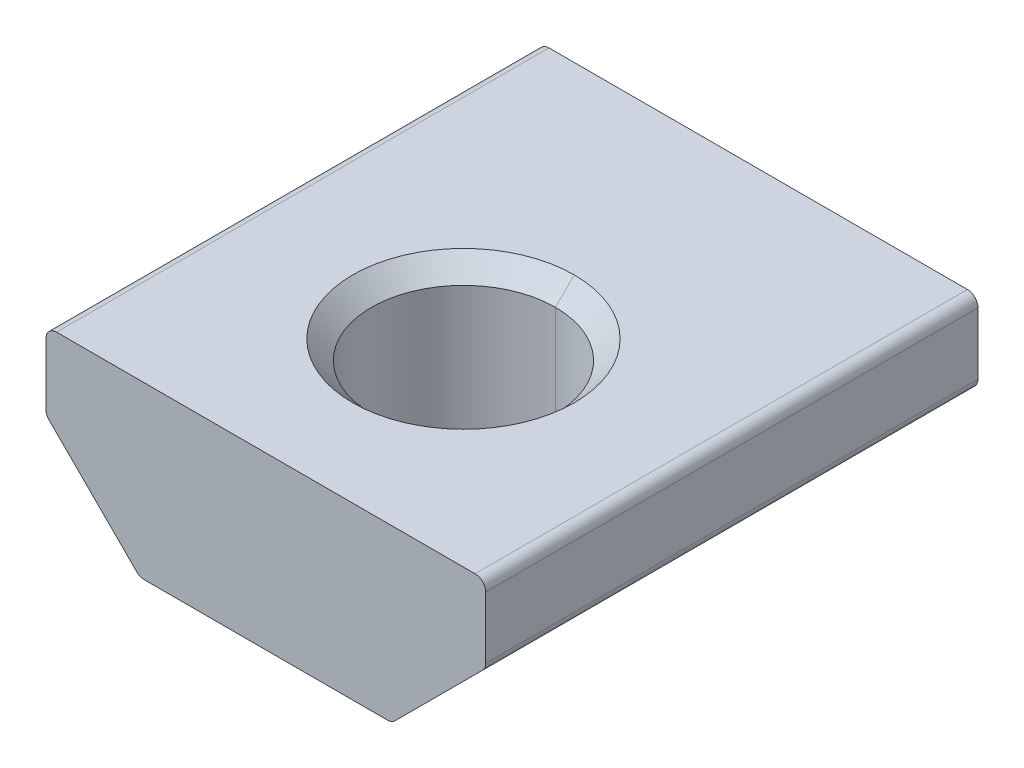
ISO-10303-21;
HEADER;
FILE_DESCRIPTION(('STEP AP214'),'2;1');
FILE_NAME('part.step','',(''),(''),'','','');
FILE_SCHEMA(('AUTOMOTIVE_DESIGN { 1 0 10303 214 1 1 1 1 }'));
ENDSEC;
DATA;
#1=APPLICATION_CONTEXT('core data for automotive mechanical design processes');
#2=APPLICATION_PROTOCOL_DEFINITION('international standard','automotive_design',2000,#1);
#3=PRODUCT_CONTEXT('',#1,'mechanical');
#4=PRODUCT('Part','Part','',(#3));
#5=PRODUCT_RELATED_PRODUCT_CATEGORY('part','',(#4));
#6=PRODUCT_DEFINITION_FORMATION('','',#4);
#7=PRODUCT_DEFINITION_CONTEXT('part definition',#1,'design');
#8=PRODUCT_DEFINITION('design','',#6,#7);
#9=PRODUCT_DEFINITION_SHAPE('','',#8);
#10=(LENGTH_UNIT() NAMED_UNIT(*) SI_UNIT(.MILLI.,.METRE.));
#11=(NAMED_UNIT(*) PLANE_ANGLE_UNIT() SI_UNIT($,.RADIAN.));
#12=(NAMED_UNIT(*) SI_UNIT($,.STERADIAN.) SOLID_ANGLE_UNIT());
#13=UNCERTAINTY_MEASURE_WITH_UNIT(LENGTH_MEASURE(1.E-05),#10,'distance_accuracy_value','');
#14=(GEOMETRIC_REPRESENTATION_CONTEXT(3) GLOBAL_UNCERTAINTY_ASSIGNED_CONTEXT((#13)) GLOBAL_UNIT_ASSIGNED_CONTEXT((#10,
#11,#12)) REPRESENTATION_CONTEXT('',''));
#15=CARTESIAN_POINT('',(0.,0.,0.));
#16=DIRECTION('',(0.,0.,1.));
#17=DIRECTION('',(1.,0.,0.));
#18=AXIS2_PLACEMENT_3D('',#15,#16,#17);
#19=CARTESIAN_POINT('',(-7.5565000000003,5.77850000000041,7.13739999999918));
#20=DIRECTION('',(0.,0.,-1.));
#21=DIRECTION('',(0.707106781186627,-0.707106781186463,0.));
#22=AXIS2_PLACEMENT_3D('',#19,#20,#21);
#23=CYLINDRICAL_SURFACE('',#22,0.380999999999916);
#24=CARTESIAN_POINT('',(-7.55650000000069,5.77849999999974,-10.6426000000013));
#25=DIRECTION('',(0.,0.,1.));
#26=DIRECTION('',(0.999999999999995,0.,0.));
#27=AXIS2_PLACEMENT_3D('',#24,#25,#26);
#28=CIRCLE('',#27,0.380999999999916);
#29=CARTESIAN_POINT('',(-7.55650000000047,6.15950000000054,-10.6426000000003));
#30=VERTEX_POINT('',#29);
#31=CARTESIAN_POINT('',(-7.9375000000001,5.77850000000069,-10.6426000000007));
#32=VERTEX_POINT('',#31);
#33=EDGE_CURVE('E13',#30,#32,#28,.T.);
#34=ORIENTED_EDGE('',*,*,#33,.T.);
#35=DIRECTION('',(0.,0.,-1.));
#36=VECTOR('',#35,1.);
#37=CARTESIAN_POINT('',(-7.93750000000071,5.77850000000096,7.13739999999902));
#38=LINE('',#37,#36);
#39=CARTESIAN_POINT('',(-7.93750000000071,5.77850000000096,7.13739999999902));
#40=VERTEX_POINT('',#39);
#41=EDGE_CURVE('E32',#40,#32,#38,.T.);
#42=ORIENTED_EDGE('',*,*,#41,.F.);
#43=CARTESIAN_POINT('',(-7.5565000000003,5.77850000000041,7.13739999999918));
#44=DIRECTION('',(0.,0.,1.));
#45=DIRECTION('',(0.999999999999995,0.,0.));
#46=AXIS2_PLACEMENT_3D('',#43,#44,#45);
#47=CIRCLE('',#46,0.380999999999916);
#48=CARTESIAN_POINT('',(-7.55650000000052,6.15950000000059,7.13739999999924));
#49=VERTEX_POINT('',#48);
#50=EDGE_CURVE('E365',#49,#40,#47,.T.);
#51=ORIENTED_EDGE('',*,*,#50,.F.);
#52=DIRECTION('',(0.,0.,-1.));
#53=VECTOR('',#52,1.);
#54=CARTESIAN_POINT('',(-7.55650000000052,6.15950000000059,7.13739999999924));
#55=LINE('',#54,#53);
#56=EDGE_CURVE('E361',#49,#30,#55,.T.);
#57=ORIENTED_EDGE('',*,*,#56,.T.);
#58=EDGE_LOOP('',(#34,#42,#51,#57));
#59=FACE_BOUND('',#58,.T.);
#60=ADVANCED_FACE('F24',(#59),#23,.T.);
#61=CARTESIAN_POINT('',(7.55650000000013,6.15950000000076,7.13739999999946));
#62=DIRECTION('',(0.,-0.999999999999995,0.));
#63=DIRECTION('',(0.,0.,-1.));
#64=AXIS2_PLACEMENT_3D('',#61,#62,#63);
#65=PLANE('',#64);
#66=CARTESIAN_POINT('',(0.,6.15950000000065,-8.32667268468867E-13));
#67=DIRECTION('',(0.,-0.999999999999995,0.));
#68=DIRECTION('',(0.,0.,-1.));
#69=AXIS2_PLACEMENT_3D('',#66,#67,#68);
#70=CIRCLE('',#69,4.);
#71=CARTESIAN_POINT('',(-2.22044604925031E-13,6.15950000000109,-4.00000000000039));
#72=VERTEX_POINT('',#71);
#73=CARTESIAN_POINT('',(-4.9960036108132E-13,6.15950000000132,3.99999999999945));
#74=VERTEX_POINT('',#73);
#75=EDGE_CURVE('E357',#72,#74,#70,.T.);
#76=ORIENTED_EDGE('',*,*,#75,.T.);
#77=CARTESIAN_POINT('',(0.,6.15950000000065,-8.32667268468867E-13));
#78=DIRECTION('',(0.,-0.999999999999995,0.));
#79=DIRECTION('',(0.,0.,-1.));
#80=AXIS2_PLACEMENT_3D('',#77,#78,#79);
#81=CIRCLE('',#80,4.);
#82=EDGE_CURVE('E163',#74,#72,#81,.T.);
#83=ORIENTED_EDGE('',*,*,#82,.T.);
#84=EDGE_LOOP('',(#76,#83));
#85=FACE_BOUND('',#84,.T.);
#86=DIRECTION('',(-0.999999999999995,0.,0.));
#87=VECTOR('',#86,1.);
#88=CARTESIAN_POINT('',(7.5565000000003,6.15949999999993,-10.6426000000004));
#89=LINE('',#88,#87);
#90=CARTESIAN_POINT('',(7.5565000000003,6.15949999999993,-10.6426000000004));
#91=VERTEX_POINT('',#90);
#92=EDGE_CURVE('E349',#91,#30,#89,.T.);
#93=ORIENTED_EDGE('',*,*,#92,.T.);
#94=ORIENTED_EDGE('',*,*,#56,.F.);
#95=DIRECTION('',(-0.999999999999995,0.,0.));
#96=VECTOR('',#95,1.);
#97=CARTESIAN_POINT('',(7.55650000000013,6.15950000000076,7.13739999999946));
#98=LINE('',#97,#96);
#99=CARTESIAN_POINT('',(7.55650000000013,6.15950000000076,7.13739999999946));
#100=VERTEX_POINT('',#99);
#101=EDGE_CURVE('E344',#100,#49,#98,.T.);
#102=ORIENTED_EDGE('',*,*,#101,.F.);
#103=DIRECTION('',(0.,0.,-1.));
#104=VECTOR('',#103,1.);
#105=CARTESIAN_POINT('',(7.55650000000013,6.15950000000076,7.13739999999946));
#106=LINE('',#105,#104);
#107=EDGE_CURVE('E340',#100,#91,#106,.T.);
#108=ORIENTED_EDGE('',*,*,#107,.T.);
#109=EDGE_LOOP('',(#93,#94,#102,#108));
#110=FACE_BOUND('',#109,.T.);
#111=ADVANCED_FACE('F382',(#85,#110),#65,.F.);
#112=CARTESIAN_POINT('',(7.55649999999985,5.77850000000085,7.13739999999979));
#113=DIRECTION('',(0.,0.,-1.));
#114=DIRECTION('',(-0.707106781186542,-0.707106781186545,0.));
#115=AXIS2_PLACEMENT_3D('',#112,#113,#114);
#116=CYLINDRICAL_SURFACE('',#115,0.380999999999915);
#117=CARTESIAN_POINT('',(7.5564999999998,5.77850000000041,-10.6426000000009));
#118=DIRECTION('',(0.,0.,1.));
#119=DIRECTION('',(0.999999999999995,0.,0.));
#120=AXIS2_PLACEMENT_3D('',#117,#118,#119);
#121=CIRCLE('',#120,0.380999999999915);
#122=CARTESIAN_POINT('',(7.93749999999938,5.7785000000003,-10.6426000000008));
#123=VERTEX_POINT('',#122);
#124=EDGE_CURVE('E335',#123,#91,#121,.T.);
#125=ORIENTED_EDGE('',*,*,#124,.T.);
#126=ORIENTED_EDGE('',*,*,#107,.F.);
#127=CARTESIAN_POINT('',(7.55649999999985,5.77850000000085,7.13739999999979));
#128=DIRECTION('',(0.,0.,1.));
#129=DIRECTION('',(0.999999999999995,0.,0.));
#130=AXIS2_PLACEMENT_3D('',#127,#128,#129);
#131=CIRCLE('',#130,0.380999999999915);
#132=CARTESIAN_POINT('',(7.93749999999993,5.77850000000046,7.13739999999918));
#133=VERTEX_POINT('',#132);
#134=EDGE_CURVE('E330',#133,#100,#131,.T.);
#135=ORIENTED_EDGE('',*,*,#134,.F.);
#136=DIRECTION('',(0.,0.,-1.));
#137=VECTOR('',#136,1.);
#138=CARTESIAN_POINT('',(7.93749999999993,5.77850000000046,7.13739999999918));
#139=LINE('',#138,#137);
#140=EDGE_CURVE('E326',#133,#123,#139,.T.);
#141=ORIENTED_EDGE('',*,*,#140,.T.);
#142=EDGE_LOOP('',(#125,#126,#135,#141));
#143=FACE_BOUND('',#142,.T.);
#144=ADVANCED_FACE('F420',(#143),#116,.T.);
#145=CARTESIAN_POINT('',(7.93749999999999,3.54554036726429,7.13739999999946));
#146=DIRECTION('',(-0.999999999999995,0.,0.));
#147=DIRECTION('',(0.,0.,1.));
#148=AXIS2_PLACEMENT_3D('',#145,#146,#147);
#149=PLANE('',#148);
#150=DIRECTION('',(0.,0.999999999999995,0.));
#151=VECTOR('',#150,1.);
#152=CARTESIAN_POINT('',(7.93749999999993,3.54554036726423,-10.6426000000006));
#153=LINE('',#152,#151);
#154=CARTESIAN_POINT('',(7.93749999999993,3.54554036726423,-10.6426000000006));
#155=VERTEX_POINT('',#154);
#156=EDGE_CURVE('E321',#155,#123,#153,.T.);
#157=ORIENTED_EDGE('',*,*,#156,.T.);
#158=ORIENTED_EDGE('',*,*,#140,.F.);
#159=DIRECTION('',(0.,0.999999999999995,0.));
#160=VECTOR('',#159,1.);
#161=CARTESIAN_POINT('',(7.93749999999999,3.54554036726429,7.13739999999946));
#162=LINE('',#161,#160);
#163=CARTESIAN_POINT('',(7.93749999999999,3.54554036726429,7.13739999999946));
#164=VERTEX_POINT('',#163);
#165=EDGE_CURVE('E316',#164,#133,#162,.T.);
#166=ORIENTED_EDGE('',*,*,#165,.F.);
#167=DIRECTION('',(0.,0.,-1.));
#168=VECTOR('',#167,1.);
#169=CARTESIAN_POINT('',(7.93749999999999,3.54554036726429,7.13739999999946));
#170=LINE('',#169,#168);
#171=EDGE_CURVE('E312',#164,#155,#170,.T.);
#172=ORIENTED_EDGE('',*,*,#171,.T.);
#173=EDGE_LOOP('',(#157,#158,#166,#172));
#174=FACE_BOUND('',#173,.T.);
#175=ADVANCED_FACE('F418',(#174),#149,.F.);
#176=CARTESIAN_POINT('',(7.55650000000013,3.54554036726434,7.13739999999957));
#177=DIRECTION('',(0.,0.,-1.));
#178=DIRECTION('',(-0.923879532511274,0.382683432365106,0.));
#179=AXIS2_PLACEMENT_3D('',#176,#177,#178);
#180=CYLINDRICAL_SURFACE('',#179,0.380999999999765);
#181=CARTESIAN_POINT('',(7.5564999999998,3.54554036726462,-10.642600000001));
#182=DIRECTION('',(0.,0.,1.));
#183=DIRECTION('',(0.999999999999995,0.,0.));
#184=AXIS2_PLACEMENT_3D('',#181,#182,#183);
#185=CIRCLE('',#184,0.380999999999765);
#186=CARTESIAN_POINT('',(7.82590768363201,3.27613268363269,-10.6426000000009));
#187=VERTEX_POINT('',#186);
#188=EDGE_CURVE('E307',#187,#155,#185,.T.);
#189=ORIENTED_EDGE('',*,*,#188,.T.);
#190=ORIENTED_EDGE('',*,*,#171,.F.);
#191=CARTESIAN_POINT('',(7.55650000000013,3.54554036726434,7.13739999999957));
#192=DIRECTION('',(0.,0.,1.));
#193=DIRECTION('',(0.999999999999995,0.,0.));
#194=AXIS2_PLACEMENT_3D('',#191,#192,#193);
#195=CIRCLE('',#194,0.380999999999765);
#196=CARTESIAN_POINT('',(7.82590768363156,3.27613268363269,7.13739999999896));
#197=VERTEX_POINT('',#196);
#198=EDGE_CURVE('E302',#197,#164,#195,.T.);
#199=ORIENTED_EDGE('',*,*,#198,.F.);
#200=DIRECTION('',(0.,0.,-1.));
#201=VECTOR('',#200,1.);
#202=CARTESIAN_POINT('',(7.82590768363156,3.27613268363269,7.13739999999896));
#203=LINE('',#202,#201);
#204=EDGE_CURVE('E298',#197,#187,#203,.T.);
#205=ORIENTED_EDGE('',*,*,#204,.T.);
#206=EDGE_LOOP('',(#189,#190,#199,#205));
#207=FACE_BOUND('',#206,.T.);
#208=ADVANCED_FACE('F413',(#207),#180,.T.);
#209=CARTESIAN_POINT('',(4.66136731636735,0.111592316368148,7.13740000000007));
#210=DIRECTION('',(-0.707106781186542,0.707106781186548,0.));
#211=DIRECTION('',(-0.707106781186546,-0.707106781186541,0.));
#212=AXIS2_PLACEMENT_3D('',#209,#210,#211);
#213=PLANE('',#212);
#214=DIRECTION('',(0.707106781186546,0.707106781186541,0.));
#215=VECTOR('',#214,1.);
#216=CARTESIAN_POINT('',(4.66136731636829,0.111592316368203,-10.6426000000008));
#217=LINE('',#216,#215);
#218=CARTESIAN_POINT('',(4.66136731636829,0.111592316368203,-10.6426000000008));
#219=VERTEX_POINT('',#218);
#220=EDGE_CURVE('E293',#219,#187,#217,.T.);
#221=ORIENTED_EDGE('',*,*,#220,.T.);
#222=ORIENTED_EDGE('',*,*,#204,.F.);
#223=DIRECTION('',(0.707106781186546,0.707106781186541,0.));
#224=VECTOR('',#223,1.);
#225=CARTESIAN_POINT('',(4.66136731636735,0.111592316368148,7.13740000000007));
#226=LINE('',#225,#224);
#227=CARTESIAN_POINT('',(4.66136731636735,0.111592316368148,7.13740000000007));
#228=VERTEX_POINT('',#227);
#229=EDGE_CURVE('E288',#228,#197,#226,.T.);
#230=ORIENTED_EDGE('',*,*,#229,.F.);
#231=DIRECTION('',(0.,0.,-1.));
#232=VECTOR('',#231,1.);
#233=CARTESIAN_POINT('',(4.66136731636735,0.111592316368148,7.13740000000007));
#234=LINE('',#233,#232);
#235=EDGE_CURVE('E284',#228,#219,#234,.T.);
#236=ORIENTED_EDGE('',*,*,#235,.T.);
#237=EDGE_LOOP('',(#221,#222,#230,#236));
#238=FACE_BOUND('',#237,.T.);
#239=ADVANCED_FACE('F410',(#238),#213,.F.);
#240=CARTESIAN_POINT('',(4.39195963273559,0.381000000000575,7.13739999999957));
#241=DIRECTION('',(0.,0.,-1.));
#242=DIRECTION('',(-0.382683432365044,0.923879532511302,0.));
#243=AXIS2_PLACEMENT_3D('',#240,#241,#242);
#244=CYLINDRICAL_SURFACE('',#243,0.381000000000144);
#245=CARTESIAN_POINT('',(4.39195963273598,0.381000000000742,-10.6426000000002));
#246=DIRECTION('',(0.,0.,1.));
#247=DIRECTION('',(0.999999999999995,0.,0.));
#248=AXIS2_PLACEMENT_3D('',#245,#246,#247);
#249=CIRCLE('',#248,0.381000000000144);
#250=CARTESIAN_POINT('',(4.39195963273575,2.22044604925031E-13,-10.6426));
#251=VERTEX_POINT('',#250);
#252=EDGE_CURVE('E279',#251,#219,#249,.T.);
#253=ORIENTED_EDGE('',*,*,#252,.T.);
#254=ORIENTED_EDGE('',*,*,#235,.F.);
#255=CARTESIAN_POINT('',(4.39195963273559,0.381000000000575,7.13739999999957));
#256=DIRECTION('',(0.,0.,1.));
#257=DIRECTION('',(0.999999999999995,0.,0.));
#258=AXIS2_PLACEMENT_3D('',#255,#256,#257);
#259=CIRCLE('',#258,0.381000000000144);
#260=CARTESIAN_POINT('',(4.39195963273598,5.55111512312578E-13,7.13739999999957));
#261=VERTEX_POINT('',#260);
#262=EDGE_CURVE('E274',#261,#228,#259,.T.);
#263=ORIENTED_EDGE('',*,*,#262,.F.);
#264=DIRECTION('',(0.,0.,-1.));
#265=VECTOR('',#264,1.);
#266=CARTESIAN_POINT('',(4.39195963273598,5.55111512312578E-13,7.13739999999957));
#267=LINE('',#266,#265);
#268=EDGE_CURVE('E270',#261,#251,#267,.T.);
#269=ORIENTED_EDGE('',*,*,#268,.T.);
#270=EDGE_LOOP('',(#253,#254,#263,#269));
#271=FACE_BOUND('',#270,.T.);
#272=ADVANCED_FACE('F407',(#271),#244,.T.);
#273=CARTESIAN_POINT('',(-4.39195963273631,1.11022302462516E-13,7.13739999999929));
#274=DIRECTION('',(0.,0.999999999999995,0.));
#275=DIRECTION('',(0.,0.,1.));
#276=AXIS2_PLACEMENT_3D('',#273,#274,#275);
#277=PLANE('',#276);
#278=CARTESIAN_POINT('',(0.,0.,0.));
#279=DIRECTION('',(0.,-0.999999999999995,0.));
#280=DIRECTION('',(0.,0.,-1.));
#281=AXIS2_PLACEMENT_3D('',#278,#279,#280);
#282=CIRCLE('',#281,4.);
#283=CARTESIAN_POINT('',(0.,0.,3.99999999999934));
#284=VERTEX_POINT('',#283);
#285=CARTESIAN_POINT('',(3.33066907387547E-13,1.66533453693773E-13,-4.00000000000106));
#286=VERTEX_POINT('',#285);
#287=EDGE_CURVE('E265',#284,#286,#282,.T.);
#288=ORIENTED_EDGE('',*,*,#287,.F.);
#289=CARTESIAN_POINT('',(0.,0.,0.));
#290=DIRECTION('',(0.,-0.999999999999995,0.));
#291=DIRECTION('',(0.,0.,-1.));
#292=AXIS2_PLACEMENT_3D('',#289,#290,#291);
#293=CIRCLE('',#292,4.);
#294=EDGE_CURVE('E260',#286,#284,#293,.T.);
#295=ORIENTED_EDGE('',*,*,#294,.F.);
#296=EDGE_LOOP('',(#288,#295));
#297=FACE_BOUND('',#296,.T.);
#298=DIRECTION('',(0.999999999999995,0.,0.));
#299=VECTOR('',#298,1.);
#300=CARTESIAN_POINT('',(-4.39195963273586,8.88178419700125E-13,-10.6425999999999));
#301=LINE('',#300,#299);
#302=CARTESIAN_POINT('',(-4.39195963273586,8.88178419700125E-13,-10.6425999999999));
#303=VERTEX_POINT('',#302);
#304=EDGE_CURVE('E255',#303,#251,#301,.T.);
#305=ORIENTED_EDGE('',*,*,#304,.T.);
#306=ORIENTED_EDGE('',*,*,#268,.F.);
#307=DIRECTION('',(0.999999999999995,0.,0.));
#308=VECTOR('',#307,1.);
#309=CARTESIAN_POINT('',(-4.39195963273631,1.11022302462516E-13,7.13739999999929));
#310=LINE('',#309,#308);
#311=CARTESIAN_POINT('',(-4.39195963273631,1.11022302462516E-13,7.13739999999929));
#312=VERTEX_POINT('',#311);
#313=EDGE_CURVE('E250',#312,#261,#310,.T.);
#314=ORIENTED_EDGE('',*,*,#313,.F.);
#315=DIRECTION('',(0.,0.,-1.));
#316=VECTOR('',#315,1.);
#317=CARTESIAN_POINT('',(-4.39195963273631,1.11022302462516E-13,7.13739999999929));
#318=LINE('',#317,#316);
#319=EDGE_CURVE('E246',#312,#303,#318,.T.);
#320=ORIENTED_EDGE('',*,*,#319,.T.);
#321=EDGE_LOOP('',(#305,#306,#314,#320));
#322=FACE_BOUND('',#321,.T.);
#323=ADVANCED_FACE('F401',(#297,#322),#277,.F.);
#324=CARTESIAN_POINT('',(-4.39195963273592,0.38100000000002,7.13740000000007));
#325=DIRECTION('',(0.,0.,-1.));
#326=DIRECTION('',(0.382683432365162,0.923879532511251,0.));
#327=AXIS2_PLACEMENT_3D('',#324,#325,#326);
#328=CYLINDRICAL_SURFACE('',#327,0.380999999999677);
#329=CARTESIAN_POINT('',(-4.39195963273625,0.381000000000298,-10.6426000000001));
#330=DIRECTION('',(0.,0.,1.));
#331=DIRECTION('',(0.999999999999995,0.,0.));
#332=AXIS2_PLACEMENT_3D('',#329,#330,#331);
#333=CIRCLE('',#332,0.380999999999677);
#334=CARTESIAN_POINT('',(-4.66136731636807,0.111592316368425,-10.6426000000005));
#335=VERTEX_POINT('',#334);
#336=EDGE_CURVE('E241',#335,#303,#333,.T.);
#337=ORIENTED_EDGE('',*,*,#336,.T.);
#338=ORIENTED_EDGE('',*,*,#319,.F.);
#339=CARTESIAN_POINT('',(-4.39195963273592,0.38100000000002,7.13740000000007));
#340=DIRECTION('',(0.,0.,1.));
#341=DIRECTION('',(0.999999999999995,0.,0.));
#342=AXIS2_PLACEMENT_3D('',#339,#340,#341);
#343=CIRCLE('',#342,0.380999999999677);
#344=CARTESIAN_POINT('',(-4.66136731636874,0.111592316368314,7.13739999999935));
#345=VERTEX_POINT('',#344);
#346=EDGE_CURVE('E236',#345,#312,#343,.T.);
#347=ORIENTED_EDGE('',*,*,#346,.F.);
#348=DIRECTION('',(0.,0.,-1.));
#349=VECTOR('',#348,1.);
#350=CARTESIAN_POINT('',(-4.66136731636874,0.111592316368314,7.13739999999935));
#351=LINE('',#350,#349);
#352=EDGE_CURVE('E232',#345,#335,#351,.T.);
#353=ORIENTED_EDGE('',*,*,#352,.T.);
#354=EDGE_LOOP('',(#337,#338,#347,#353));
#355=FACE_BOUND('',#354,.T.);
#356=ADVANCED_FACE('F398',(#355),#328,.T.);
#357=CARTESIAN_POINT('',(-7.82590768363284,3.27613268363247,7.13739999999918));
#358=DIRECTION('',(0.70710678118654,0.707106781186547,0.));
#359=DIRECTION('',(-0.707106781186546,0.707106781186542,0.));
#360=AXIS2_PLACEMENT_3D('',#357,#358,#359);
#361=PLANE('',#360);
#362=DIRECTION('',(0.707106781186546,-0.707106781186542,0.));
#363=VECTOR('',#362,1.);
#364=CARTESIAN_POINT('',(-7.82590768363256,3.27613268363264,-10.6426000000008));
#365=LINE('',#364,#363);
#366=CARTESIAN_POINT('',(-7.82590768363256,3.27613268363264,-10.6426000000008));
#367=VERTEX_POINT('',#366);
#368=EDGE_CURVE('E227',#367,#335,#365,.T.);
#369=ORIENTED_EDGE('',*,*,#368,.T.);
#370=ORIENTED_EDGE('',*,*,#352,.F.);
#371=DIRECTION('',(0.707106781186546,-0.707106781186542,0.));
#372=VECTOR('',#371,1.);
#373=CARTESIAN_POINT('',(-7.82590768363284,3.27613268363247,7.13739999999918));
#374=LINE('',#373,#372);
#375=CARTESIAN_POINT('',(-7.82590768363284,3.27613268363247,7.13739999999918));
#376=VERTEX_POINT('',#375);
#377=EDGE_CURVE('E222',#376,#345,#374,.T.);
#378=ORIENTED_EDGE('',*,*,#377,.F.);
#379=DIRECTION('',(0.,0.,-1.));
#380=VECTOR('',#379,1.);
#381=CARTESIAN_POINT('',(-7.82590768363284,3.27613268363247,7.13739999999918));
#382=LINE('',#381,#380);
#383=EDGE_CURVE('E218',#376,#367,#382,.T.);
#384=ORIENTED_EDGE('',*,*,#383,.T.);
#385=EDGE_LOOP('',(#369,#370,#378,#384));
#386=FACE_BOUND('',#385,.T.);
#387=ADVANCED_FACE('F396',(#386),#361,.F.);
#388=CARTESIAN_POINT('',(-7.5565000000003,3.54554036726529,7.13739999999985));
#389=DIRECTION('',(0.,0.,-1.));
#390=DIRECTION('',(0.923879532511275,0.382683432365105,0.));
#391=AXIS2_PLACEMENT_3D('',#388,#389,#390);
#392=CYLINDRICAL_SURFACE('',#391,0.38100000000023);
#393=CARTESIAN_POINT('',(-7.55650000000008,3.54554036726473,-10.6426000000007));
#394=DIRECTION('',(0.,0.,1.));
#395=DIRECTION('',(0.999999999999995,0.,0.));
#396=AXIS2_PLACEMENT_3D('',#393,#394,#395);
#397=CIRCLE('',#396,0.38100000000023);
#398=CARTESIAN_POINT('',(-7.93750000000071,3.54554036726445,-10.6426000000003));
#399=VERTEX_POINT('',#398);
#400=EDGE_CURVE('E213',#399,#367,#397,.T.);
#401=ORIENTED_EDGE('',*,*,#400,.T.);
#402=ORIENTED_EDGE('',*,*,#383,.F.);
#403=CARTESIAN_POINT('',(-7.5565000000003,3.54554036726529,7.13739999999985));
#404=DIRECTION('',(0.,0.,1.));
#405=DIRECTION('',(0.999999999999995,0.,0.));
#406=AXIS2_PLACEMENT_3D('',#403,#404,#405);
#407=CIRCLE('',#406,0.38100000000023);
#408=CARTESIAN_POINT('',(-7.93750000000087,3.54554036726512,7.13739999999974));
#409=VERTEX_POINT('',#408);
#410=EDGE_CURVE('E208',#409,#376,#407,.T.);
#411=ORIENTED_EDGE('',*,*,#410,.F.);
#412=DIRECTION('',(0.,0.,-1.));
#413=VECTOR('',#412,1.);
#414=CARTESIAN_POINT('',(-7.93750000000087,3.54554036726512,7.13739999999974));
#415=LINE('',#414,#413);
#416=EDGE_CURVE('E204',#409,#399,#415,.T.);
#417=ORIENTED_EDGE('',*,*,#416,.T.);
#418=EDGE_LOOP('',(#401,#402,#411,#417));
#419=FACE_BOUND('',#418,.T.);
#420=ADVANCED_FACE('F392',(#419),#392,.T.);
#421=CARTESIAN_POINT('',(-7.93750000000071,5.77850000000096,7.13739999999902));
#422=DIRECTION('',(0.999999999999995,0.,0.));
#423=DIRECTION('',(0.,0.,-1.));
#424=AXIS2_PLACEMENT_3D('',#421,#422,#423);
#425=PLANE('',#424);
#426=DIRECTION('',(0.,-0.999999999999995,0.));
#427=VECTOR('',#426,1.);
#428=CARTESIAN_POINT('',(-7.9375000000001,5.77850000000069,-10.6426000000007));
#429=LINE('',#428,#427);
#430=EDGE_CURVE('E199',#32,#399,#429,.T.);
#431=ORIENTED_EDGE('',*,*,#430,.T.);
#432=ORIENTED_EDGE('',*,*,#416,.F.);
#433=DIRECTION('',(0.,-0.999999999999995,0.));
#434=VECTOR('',#433,1.);
#435=CARTESIAN_POINT('',(-7.93750000000071,5.77850000000096,7.13739999999902));
#436=LINE('',#435,#434);
#437=EDGE_CURVE('E194',#40,#409,#436,.T.);
#438=ORIENTED_EDGE('',*,*,#437,.F.);
#439=ORIENTED_EDGE('',*,*,#41,.T.);
#440=EDGE_LOOP('',(#431,#432,#438,#439));
#441=FACE_BOUND('',#440,.T.);
#442=ADVANCED_FACE('F375',(#441),#425,.F.);
#443=CARTESIAN_POINT('',(-7.5565000000003,5.77850000000041,7.13739999999918));
#444=DIRECTION('',(0.,0.,1.));
#445=DIRECTION('',(0.999999999999995,0.,0.));
#446=AXIS2_PLACEMENT_3D('',#443,#444,#445);
#447=PLANE('',#446);
#448=ORIENTED_EDGE('',*,*,#50,.T.);
#449=ORIENTED_EDGE('',*,*,#437,.T.);
#450=ORIENTED_EDGE('',*,*,#410,.T.);
#451=ORIENTED_EDGE('',*,*,#377,.T.);
#452=ORIENTED_EDGE('',*,*,#346,.T.);
#453=ORIENTED_EDGE('',*,*,#313,.T.);
#454=ORIENTED_EDGE('',*,*,#262,.T.);
#455=ORIENTED_EDGE('',*,*,#229,.T.);
#456=ORIENTED_EDGE('',*,*,#198,.T.);
#457=ORIENTED_EDGE('',*,*,#165,.T.);
#458=ORIENTED_EDGE('',*,*,#134,.T.);
#459=ORIENTED_EDGE('',*,*,#101,.T.);
#460=EDGE_LOOP('',(#448,#449,#450,#451,#452,#453,#454,#455,#456,#457,#458,#459));
#461=FACE_BOUND('',#460,.T.);
#462=ADVANCED_FACE('F379',(#461),#447,.T.);
#463=CARTESIAN_POINT('',(-7.55650000000069,5.77849999999974,-10.6426000000013));
#464=DIRECTION('',(0.,0.,1.));
#465=DIRECTION('',(0.999999999999995,0.,0.));
#466=AXIS2_PLACEMENT_3D('',#463,#464,#465);
#467=PLANE('',#466);
#468=ORIENTED_EDGE('',*,*,#33,.F.);
#469=ORIENTED_EDGE('',*,*,#92,.F.);
#470=ORIENTED_EDGE('',*,*,#124,.F.);
#471=ORIENTED_EDGE('',*,*,#156,.F.);
#472=ORIENTED_EDGE('',*,*,#188,.F.);
#473=ORIENTED_EDGE('',*,*,#220,.F.);
#474=ORIENTED_EDGE('',*,*,#252,.F.);
#475=ORIENTED_EDGE('',*,*,#304,.F.);
#476=ORIENTED_EDGE('',*,*,#336,.F.);
#477=ORIENTED_EDGE('',*,*,#368,.F.);
#478=ORIENTED_EDGE('',*,*,#400,.F.);
#479=ORIENTED_EDGE('',*,*,#430,.F.);
#480=EDGE_LOOP('',(#468,#469,#470,#471,#472,#473,#474,#475,#476,#477,#478,#479));
#481=FACE_BOUND('',#480,.T.);
#482=ADVANCED_FACE('F387',(#481),#467,.F.);
#483=CARTESIAN_POINT('',(2.22044604925031E-13,0.676500000001579,-9.99200722162641E-13));
#484=DIRECTION('',(0.,-0.999999999999995,0.));
#485=DIRECTION('',(-0.999999999999995,0.,0.));
#486=AXIS2_PLACEMENT_3D('',#483,#484,#485);
#487=CONICAL_SURFACE('',#486,3.3235,0.785398163397448);
#488=DIRECTION('',(0.,-0.707106781186545,0.707106781186549));
#489=VECTOR('',#488,1.);
#490=CARTESIAN_POINT('',(5.55111512312578E-13,0.676500000000912,3.32349999999959));
#491=LINE('',#490,#489);
#492=CARTESIAN_POINT('',(5.55111512312578E-13,0.676500000000912,3.32349999999959));
#493=VERTEX_POINT('',#492);
#494=EDGE_CURVE('E189',#493,#284,#491,.T.);
#495=ORIENTED_EDGE('',*,*,#494,.F.);
#496=CARTESIAN_POINT('',(2.22044604925031E-13,0.676500000001579,-9.99200722162641E-13));
#497=DIRECTION('',(0.,-0.999999999999995,0.));
#498=DIRECTION('',(0.,0.,-1.));
#499=AXIS2_PLACEMENT_3D('',#496,#497,#498);
#500=CIRCLE('',#499,3.3235);
#501=CARTESIAN_POINT('',(-2.22044604925031E-13,0.676500000001246,-3.3235000000012));
#502=VERTEX_POINT('',#501);
#503=EDGE_CURVE('E152',#502,#493,#500,.T.);
#504=ORIENTED_EDGE('',*,*,#503,.F.);
#505=DIRECTION('',(0.,-0.707106781186546,-0.707106781186548));
#506=VECTOR('',#505,1.);
#507=CARTESIAN_POINT('',(-2.22044604925031E-13,0.676500000001246,-3.3235000000012));
#508=LINE('',#507,#506);
#509=EDGE_CURVE('E181',#502,#286,#508,.T.);
#510=ORIENTED_EDGE('',*,*,#509,.T.);
#511=ORIENTED_EDGE('',*,*,#294,.T.);
#512=EDGE_LOOP('',(#495,#504,#510,#511));
#513=FACE_BOUND('',#512,.T.);
#514=ADVANCED_FACE('F537',(#513),#487,.F.);
#515=CARTESIAN_POINT('',(2.22044604925031E-13,0.676500000001579,-9.99200722162641E-13));
#516=DIRECTION('',(0.,-0.999999999999995,0.));
#517=DIRECTION('',(0.999999999999994,0.,0.));
#518=AXIS2_PLACEMENT_3D('',#515,#516,#517);
#519=CONICAL_SURFACE('',#518,3.3235,0.785398163397448);
#520=ORIENTED_EDGE('',*,*,#494,.T.);
#521=ORIENTED_EDGE('',*,*,#287,.T.);
#522=ORIENTED_EDGE('',*,*,#509,.F.);
#523=CARTESIAN_POINT('',(2.22044604925031E-13,0.676500000001579,-9.99200722162641E-13));
#524=DIRECTION('',(0.,-0.999999999999995,0.));
#525=DIRECTION('',(0.,0.,-1.));
#526=AXIS2_PLACEMENT_3D('',#523,#524,#525);
#527=CIRCLE('',#526,3.3235);
#528=EDGE_CURVE('E153',#493,#502,#527,.T.);
#529=ORIENTED_EDGE('',*,*,#528,.F.);
#530=EDGE_LOOP('',(#520,#521,#522,#529));
#531=FACE_BOUND('',#530,.T.);
#532=ADVANCED_FACE('F546',(#531),#519,.F.);
#533=CARTESIAN_POINT('',(0.,0.,0.));
#534=DIRECTION('',(0.,-0.999999999999995,0.));
#535=DIRECTION('',(0.999999999999994,0.,0.));
#536=AXIS2_PLACEMENT_3D('',#533,#534,#535);
#537=CYLINDRICAL_SURFACE('',#536,3.3235);
#538=DIRECTION('',(0.,-0.999999999999995,0.));
#539=VECTOR('',#538,1.);
#540=CARTESIAN_POINT('',(-5.55111512312578E-13,5.48300000000118,3.32349999999954));
#541=LINE('',#540,#539);
#542=CARTESIAN_POINT('',(-5.55111512312578E-13,5.48300000000118,3.32349999999954));
#543=VERTEX_POINT('',#542);
#544=EDGE_CURVE('E137',#543,#493,#541,.T.);
#545=ORIENTED_EDGE('',*,*,#544,.T.);
#546=ORIENTED_EDGE('',*,*,#528,.T.);
#547=DIRECTION('',(0.,-0.999999999999995,0.));
#548=VECTOR('',#547,1.);
#549=CARTESIAN_POINT('',(-4.44089209850063E-13,5.48300000000174,-3.32350000000031));
#550=LINE('',#549,#548);
#551=CARTESIAN_POINT('',(-4.44089209850063E-13,5.48300000000174,-3.32350000000031));
#552=VERTEX_POINT('',#551);
#553=EDGE_CURVE('E140',#552,#502,#550,.T.);
#554=ORIENTED_EDGE('',*,*,#553,.F.);
#555=CARTESIAN_POINT('',(6.66133814775094E-13,5.48300000000118,-2.22044604925031E-13));
#556=DIRECTION('',(0.,-0.999999999999995,0.));
#557=DIRECTION('',(0.,0.,-1.));
#558=AXIS2_PLACEMENT_3D('',#555,#556,#557);
#559=CIRCLE('',#558,3.3235);
#560=EDGE_CURVE('E133',#543,#552,#559,.T.);
#561=ORIENTED_EDGE('',*,*,#560,.F.);
#562=EDGE_LOOP('',(#545,#546,#554,#561));
#563=FACE_BOUND('',#562,.T.);
#564=ADVANCED_FACE('F135',(#563),#537,.F.);
#565=CARTESIAN_POINT('',(0.,6.15950000000065,-8.32667268468867E-13));
#566=DIRECTION('',(0.,0.999999999999995,0.));
#567=DIRECTION('',(0.999999999999995,0.,0.));
#568=AXIS2_PLACEMENT_3D('',#565,#566,#567);
#569=CONICAL_SURFACE('',#568,4.,0.785398163397448);
#570=DIRECTION('',(0.,0.707106781186544,-0.707106781186548));
#571=VECTOR('',#570,1.);
#572=CARTESIAN_POINT('',(-4.44089209850063E-13,5.48300000000174,-3.32350000000031));
#573=LINE('',#572,#571);
#574=EDGE_CURVE('E145',#552,#72,#573,.T.);
#575=ORIENTED_EDGE('',*,*,#574,.T.);
#576=ORIENTED_EDGE('',*,*,#82,.F.);
#577=DIRECTION('',(0.,0.707106781186546,0.707106781186549));
#578=VECTOR('',#577,1.);
#579=CARTESIAN_POINT('',(-5.55111512312578E-13,5.48300000000118,3.32349999999954));
#580=LINE('',#579,#578);
#581=EDGE_CURVE('E159',#543,#74,#580,.T.);
#582=ORIENTED_EDGE('',*,*,#581,.F.);
#583=ORIENTED_EDGE('',*,*,#560,.T.);
#584=EDGE_LOOP('',(#575,#576,#582,#583));
#585=FACE_BOUND('',#584,.T.);
#586=ADVANCED_FACE('F162',(#585),#569,.F.);
#587=CARTESIAN_POINT('',(0.,6.15950000000065,-8.32667268468867E-13));
#588=DIRECTION('',(0.,0.999999999999995,0.));
#589=DIRECTION('',(-0.999999999999994,0.,0.));
#590=AXIS2_PLACEMENT_3D('',#587,#588,#589);
#591=CONICAL_SURFACE('',#590,4.,0.785398163397448);
#592=ORIENTED_EDGE('',*,*,#574,.F.);
#593=CARTESIAN_POINT('',(6.66133814775094E-13,5.48300000000118,-2.22044604925031E-13));
#594=DIRECTION('',(0.,-0.999999999999995,0.));
#595=DIRECTION('',(0.,0.,-1.));
#596=AXIS2_PLACEMENT_3D('',#593,#594,#595);
#597=CIRCLE('',#596,3.3235);
#598=EDGE_CURVE('E150',#552,#543,#597,.T.);
#599=ORIENTED_EDGE('',*,*,#598,.T.);
#600=ORIENTED_EDGE('',*,*,#581,.T.);
#601=ORIENTED_EDGE('',*,*,#75,.F.);
#602=EDGE_LOOP('',(#592,#599,#600,#601));
#603=FACE_BOUND('',#602,.T.);
#604=ADVANCED_FACE('F157',(#603),#591,.F.);
#605=CARTESIAN_POINT('',(0.,0.,0.));
#606=DIRECTION('',(0.,-0.999999999999995,0.));
#607=DIRECTION('',(-0.999999999999994,0.,0.));
#608=AXIS2_PLACEMENT_3D('',#605,#606,#607);
#609=CYLINDRICAL_SURFACE('',#608,3.3235);
#610=ORIENTED_EDGE('',*,*,#544,.F.);
#611=ORIENTED_EDGE('',*,*,#598,.F.);
#612=ORIENTED_EDGE('',*,*,#553,.T.);
#613=ORIENTED_EDGE('',*,*,#503,.T.);
#614=EDGE_LOOP('',(#610,#611,#612,#613));
#615=FACE_BOUND('',#614,.T.);
#616=ADVANCED_FACE('F149',(#615),#609,.F.);
#617=CLOSED_SHELL('',(#60,#111,#144,#175,#208,#239,#272,#323,#356,#387,#420,#442,#462,#482,#514,
#532,#564,#586,#604,#616));
#618=MANIFOLD_SOLID_BREP('B1',#617);
#619=ADVANCED_BREP_SHAPE_REPRESENTATION('',(#18,#618),#14);
#620=SHAPE_DEFINITION_REPRESENTATION(#9,#619);
ENDSEC;
END-ISO-10303-21;
